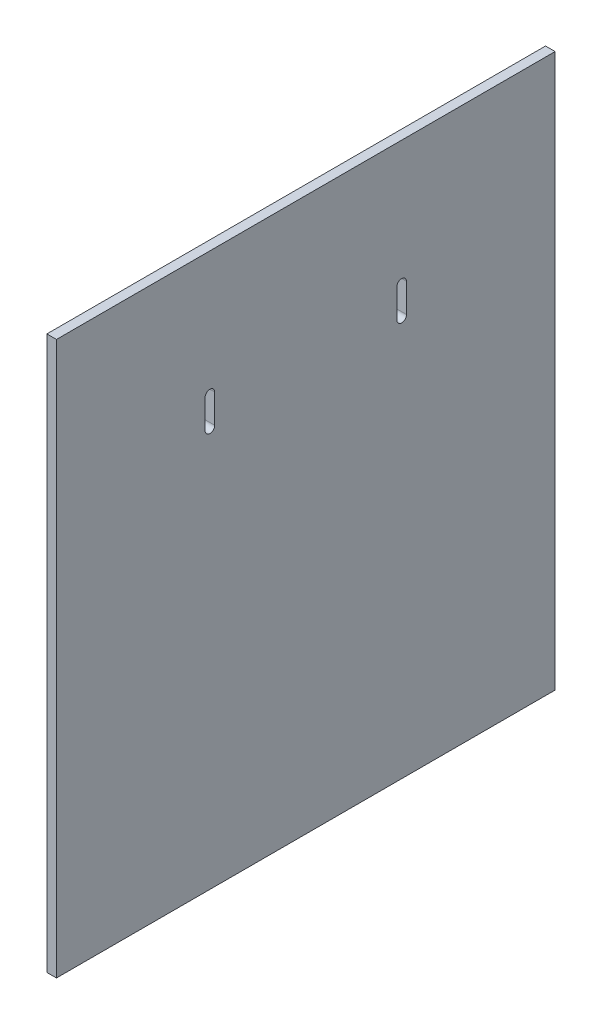
ISO-10303-21;
HEADER;
FILE_DESCRIPTION(('STEP AP214'),'2;1');
FILE_NAME('part.step','',(''),(''),'','','');
FILE_SCHEMA(('AUTOMOTIVE_DESIGN { 1 0 10303 214 1 1 1 1 }'));
ENDSEC;
DATA;
#1=APPLICATION_CONTEXT('core data for automotive mechanical design processes');
#2=APPLICATION_PROTOCOL_DEFINITION('international standard','automotive_design',2000,#1);
#3=PRODUCT_CONTEXT('',#1,'mechanical');
#4=PRODUCT('Part','Part','',(#3));
#5=PRODUCT_RELATED_PRODUCT_CATEGORY('part','',(#4));
#6=PRODUCT_DEFINITION_FORMATION('','',#4);
#7=PRODUCT_DEFINITION_CONTEXT('part definition',#1,'design');
#8=PRODUCT_DEFINITION('design','',#6,#7);
#9=PRODUCT_DEFINITION_SHAPE('','',#8);
#10=(LENGTH_UNIT() NAMED_UNIT(*) SI_UNIT(.MILLI.,.METRE.));
#11=(NAMED_UNIT(*) PLANE_ANGLE_UNIT() SI_UNIT($,.RADIAN.));
#12=(NAMED_UNIT(*) SI_UNIT($,.STERADIAN.) SOLID_ANGLE_UNIT());
#13=UNCERTAINTY_MEASURE_WITH_UNIT(LENGTH_MEASURE(1.E-05),#10,'distance_accuracy_value','');
#14=(GEOMETRIC_REPRESENTATION_CONTEXT(3) GLOBAL_UNCERTAINTY_ASSIGNED_CONTEXT((#13)) GLOBAL_UNIT_ASSIGNED_CONTEXT((#10,
#11,#12)) REPRESENTATION_CONTEXT('',''));
#15=CARTESIAN_POINT('',(0.,0.,0.));
#16=DIRECTION('',(0.,0.,1.));
#17=DIRECTION('',(1.,0.,0.));
#18=AXIS2_PLACEMENT_3D('',#15,#16,#17);
#19=CARTESIAN_POINT('',(3.,0.,0.));
#20=DIRECTION('',(0.,0.,-1.));
#21=DIRECTION('',(-1.,0.,0.));
#22=AXIS2_PLACEMENT_3D('',#19,#20,#21);
#23=PLANE('',#22);
#24=DIRECTION('',(0.,-1.,0.));
#25=VECTOR('',#24,1.);
#26=CARTESIAN_POINT('',(0.,0.,0.));
#27=LINE('',#26,#25);
#28=CARTESIAN_POINT('',(0.,173.,0.));
#29=VERTEX_POINT('',#28);
#30=CARTESIAN_POINT('',(0.,0.,0.));
#31=VERTEX_POINT('',#30);
#32=EDGE_CURVE('E158',#29,#31,#27,.T.);
#33=ORIENTED_EDGE('',*,*,#32,.T.);
#34=DIRECTION('',(-1.,0.,0.));
#35=VECTOR('',#34,1.);
#36=CARTESIAN_POINT('',(3.,0.,0.));
#37=LINE('',#36,#35);
#38=CARTESIAN_POINT('',(3.,0.,0.));
#39=VERTEX_POINT('',#38);
#40=EDGE_CURVE('E11',#39,#31,#37,.T.);
#41=ORIENTED_EDGE('',*,*,#40,.F.);
#42=DIRECTION('',(0.,-1.,0.));
#43=VECTOR('',#42,1.);
#44=CARTESIAN_POINT('',(3.,0.,0.));
#45=LINE('',#44,#43);
#46=CARTESIAN_POINT('',(3.,173.,0.));
#47=VERTEX_POINT('',#46);
#48=EDGE_CURVE('E191',#47,#39,#45,.T.);
#49=ORIENTED_EDGE('',*,*,#48,.F.);
#50=DIRECTION('',(-1.,0.,0.));
#51=VECTOR('',#50,1.);
#52=CARTESIAN_POINT('',(3.,173.,0.));
#53=LINE('',#52,#51);
#54=EDGE_CURVE('E201',#47,#29,#53,.T.);
#55=ORIENTED_EDGE('',*,*,#54,.T.);
#56=EDGE_LOOP('',(#33,#41,#49,#55));
#57=FACE_BOUND('',#56,.T.);
#58=ADVANCED_FACE('F33',(#57),#23,.F.);
#59=CARTESIAN_POINT('',(3.,0.,0.));
#60=DIRECTION('',(0.,1.,0.));
#61=DIRECTION('',(0.,0.,1.));
#62=AXIS2_PLACEMENT_3D('',#59,#60,#61);
#63=PLANE('',#62);
#64=DIRECTION('',(0.,0.,-1.));
#65=VECTOR('',#64,1.);
#66=CARTESIAN_POINT('',(0.,0.,0.));
#67=LINE('',#66,#65);
#68=CARTESIAN_POINT('',(0.,0.,-156.));
#69=VERTEX_POINT('',#68);
#70=EDGE_CURVE('E204',#31,#69,#67,.T.);
#71=ORIENTED_EDGE('',*,*,#70,.T.);
#72=DIRECTION('',(-1.,0.,0.));
#73=VECTOR('',#72,1.);
#74=CARTESIAN_POINT('',(3.,0.,-156.));
#75=LINE('',#74,#73);
#76=CARTESIAN_POINT('',(3.,0.,-156.));
#77=VERTEX_POINT('',#76);
#78=EDGE_CURVE('E40',#77,#69,#75,.T.);
#79=ORIENTED_EDGE('',*,*,#78,.F.);
#80=DIRECTION('',(0.,0.,-1.));
#81=VECTOR('',#80,1.);
#82=CARTESIAN_POINT('',(3.,0.,0.));
#83=LINE('',#82,#81);
#84=EDGE_CURVE('E194',#39,#77,#83,.T.);
#85=ORIENTED_EDGE('',*,*,#84,.F.);
#86=ORIENTED_EDGE('',*,*,#40,.T.);
#87=EDGE_LOOP('',(#71,#79,#85,#86));
#88=FACE_BOUND('',#87,.T.);
#89=ADVANCED_FACE('F233',(#88),#63,.F.);
#90=CARTESIAN_POINT('',(3.,0.,-156.));
#91=DIRECTION('',(0.,0.,1.));
#92=DIRECTION('',(1.,0.,0.));
#93=AXIS2_PLACEMENT_3D('',#90,#91,#92);
#94=PLANE('',#93);
#95=DIRECTION('',(0.,1.,0.));
#96=VECTOR('',#95,1.);
#97=CARTESIAN_POINT('',(0.,0.,-156.));
#98=LINE('',#97,#96);
#99=CARTESIAN_POINT('',(0.,173.,-156.));
#100=VERTEX_POINT('',#99);
#101=EDGE_CURVE('E206',#69,#100,#98,.T.);
#102=ORIENTED_EDGE('',*,*,#101,.T.);
#103=DIRECTION('',(-1.,0.,0.));
#104=VECTOR('',#103,1.);
#105=CARTESIAN_POINT('',(3.,173.,-156.));
#106=LINE('',#105,#104);
#107=CARTESIAN_POINT('',(3.,173.,-156.));
#108=VERTEX_POINT('',#107);
#109=EDGE_CURVE('E211',#108,#100,#106,.T.);
#110=ORIENTED_EDGE('',*,*,#109,.F.);
#111=DIRECTION('',(0.,1.,0.));
#112=VECTOR('',#111,1.);
#113=CARTESIAN_POINT('',(3.,0.,-156.));
#114=LINE('',#113,#112);
#115=EDGE_CURVE('E197',#77,#108,#114,.T.);
#116=ORIENTED_EDGE('',*,*,#115,.F.);
#117=ORIENTED_EDGE('',*,*,#78,.T.);
#118=EDGE_LOOP('',(#102,#110,#116,#117));
#119=FACE_BOUND('',#118,.T.);
#120=ADVANCED_FACE('F218',(#119),#94,.F.);
#121=CARTESIAN_POINT('',(3.,173.,0.));
#122=DIRECTION('',(0.,-1.,0.));
#123=DIRECTION('',(0.,0.,-1.));
#124=AXIS2_PLACEMENT_3D('',#121,#122,#123);
#125=PLANE('',#124);
#126=DIRECTION('',(0.,0.,1.));
#127=VECTOR('',#126,1.);
#128=CARTESIAN_POINT('',(0.,173.,0.));
#129=LINE('',#128,#127);
#130=EDGE_CURVE('E195',#100,#29,#129,.T.);
#131=ORIENTED_EDGE('',*,*,#130,.T.);
#132=ORIENTED_EDGE('',*,*,#54,.F.);
#133=DIRECTION('',(0.,0.,1.));
#134=VECTOR('',#133,1.);
#135=CARTESIAN_POINT('',(3.,173.,0.));
#136=LINE('',#135,#134);
#137=EDGE_CURVE('E199',#108,#47,#136,.T.);
#138=ORIENTED_EDGE('',*,*,#137,.F.);
#139=ORIENTED_EDGE('',*,*,#109,.T.);
#140=EDGE_LOOP('',(#131,#132,#138,#139));
#141=FACE_BOUND('',#140,.T.);
#142=ADVANCED_FACE('F226',(#141),#125,.F.);
#143=CARTESIAN_POINT('',(3.,0.,0.));
#144=DIRECTION('',(-1.,0.,0.));
#145=DIRECTION('',(0.,0.,1.));
#146=AXIS2_PLACEMENT_3D('',#143,#144,#145);
#147=PLANE('',#146);
#148=DIRECTION('',(0.,1.,0.));
#149=VECTOR('',#148,1.);
#150=CARTESIAN_POINT('',(3.,125.,-49.5));
#151=LINE('',#150,#149);
#152=CARTESIAN_POINT('',(3.,125.,-49.5));
#153=VERTEX_POINT('',#152);
#154=CARTESIAN_POINT('',(3.,134.,-49.5));
#155=VERTEX_POINT('',#154);
#156=EDGE_CURVE('E151',#153,#155,#151,.T.);
#157=ORIENTED_EDGE('',*,*,#156,.F.);
#158=CARTESIAN_POINT('',(3.,125.,-48.));
#159=DIRECTION('',(1.,0.,0.));
#160=DIRECTION('',(0.,0.,-1.));
#161=AXIS2_PLACEMENT_3D('',#158,#159,#160);
#162=CIRCLE('',#161,1.5);
#163=CARTESIAN_POINT('',(3.,125.,-46.5));
#164=VERTEX_POINT('',#163);
#165=EDGE_CURVE('E47',#164,#153,#162,.T.);
#166=ORIENTED_EDGE('',*,*,#165,.F.);
#167=DIRECTION('',(0.,-1.,0.));
#168=VECTOR('',#167,1.);
#169=CARTESIAN_POINT('',(3.,125.,-46.5));
#170=LINE('',#169,#168);
#171=CARTESIAN_POINT('',(3.,134.,-46.5));
#172=VERTEX_POINT('',#171);
#173=EDGE_CURVE('E142',#172,#164,#170,.T.);
#174=ORIENTED_EDGE('',*,*,#173,.F.);
#175=CARTESIAN_POINT('',(3.,134.,-48.));
#176=DIRECTION('',(1.,0.,0.));
#177=DIRECTION('',(0.,0.,-1.));
#178=AXIS2_PLACEMENT_3D('',#175,#176,#177);
#179=CIRCLE('',#178,1.5);
#180=EDGE_CURVE('E145',#155,#172,#179,.T.);
#181=ORIENTED_EDGE('',*,*,#180,.F.);
#182=EDGE_LOOP('',(#157,#166,#174,#181));
#183=FACE_BOUND('',#182,.T.);
#184=DIRECTION('',(0.,1.,0.));
#185=VECTOR('',#184,1.);
#186=CARTESIAN_POINT('',(3.,125.,-109.5));
#187=LINE('',#186,#185);
#188=CARTESIAN_POINT('',(3.,125.,-109.5));
#189=VERTEX_POINT('',#188);
#190=CARTESIAN_POINT('',(3.,134.,-109.5));
#191=VERTEX_POINT('',#190);
#192=EDGE_CURVE('E177',#189,#191,#187,.T.);
#193=ORIENTED_EDGE('',*,*,#192,.F.);
#194=CARTESIAN_POINT('',(3.,125.,-108.));
#195=DIRECTION('',(1.,0.,0.));
#196=DIRECTION('',(0.,0.,1.));
#197=AXIS2_PLACEMENT_3D('',#194,#195,#196);
#198=CIRCLE('',#197,1.5);
#199=CARTESIAN_POINT('',(3.,125.,-106.5));
#200=VERTEX_POINT('',#199);
#201=EDGE_CURVE('E55',#200,#189,#198,.T.);
#202=ORIENTED_EDGE('',*,*,#201,.F.);
#203=DIRECTION('',(0.,-1.,0.));
#204=VECTOR('',#203,1.);
#205=CARTESIAN_POINT('',(3.,125.,-106.5));
#206=LINE('',#205,#204);
#207=CARTESIAN_POINT('',(3.,134.,-106.5));
#208=VERTEX_POINT('',#207);
#209=EDGE_CURVE('E166',#208,#200,#206,.T.);
#210=ORIENTED_EDGE('',*,*,#209,.F.);
#211=CARTESIAN_POINT('',(3.,134.,-108.));
#212=DIRECTION('',(1.,0.,0.));
#213=DIRECTION('',(0.,0.,1.));
#214=AXIS2_PLACEMENT_3D('',#211,#212,#213);
#215=CIRCLE('',#214,1.5);
#216=EDGE_CURVE('E180',#191,#208,#215,.T.);
#217=ORIENTED_EDGE('',*,*,#216,.F.);
#218=EDGE_LOOP('',(#193,#202,#210,#217));
#219=FACE_BOUND('',#218,.T.);
#220=ORIENTED_EDGE('',*,*,#48,.T.);
#221=ORIENTED_EDGE('',*,*,#84,.T.);
#222=ORIENTED_EDGE('',*,*,#115,.T.);
#223=ORIENTED_EDGE('',*,*,#137,.T.);
#224=EDGE_LOOP('',(#220,#221,#222,#223));
#225=FACE_BOUND('',#224,.T.);
#226=ADVANCED_FACE('F232',(#183,#219,#225),#147,.F.);
#227=CARTESIAN_POINT('',(0.,0.,0.));
#228=DIRECTION('',(-1.,0.,0.));
#229=DIRECTION('',(0.,0.,1.));
#230=AXIS2_PLACEMENT_3D('',#227,#228,#229);
#231=PLANE('',#230);
#232=CARTESIAN_POINT('',(0.,125.,-48.));
#233=DIRECTION('',(1.,0.,0.));
#234=DIRECTION('',(0.,0.,-1.));
#235=AXIS2_PLACEMENT_3D('',#232,#233,#234);
#236=CIRCLE('',#235,1.5);
#237=CARTESIAN_POINT('',(0.,125.,-46.5));
#238=VERTEX_POINT('',#237);
#239=CARTESIAN_POINT('',(0.,125.,-49.5));
#240=VERTEX_POINT('',#239);
#241=EDGE_CURVE('E123',#238,#240,#236,.T.);
#242=ORIENTED_EDGE('',*,*,#241,.T.);
#243=DIRECTION('',(0.,1.,0.));
#244=VECTOR('',#243,1.);
#245=CARTESIAN_POINT('',(0.,125.,-49.5));
#246=LINE('',#245,#244);
#247=CARTESIAN_POINT('',(0.,134.,-49.5));
#248=VERTEX_POINT('',#247);
#249=EDGE_CURVE('E133',#240,#248,#246,.T.);
#250=ORIENTED_EDGE('',*,*,#249,.T.);
#251=CARTESIAN_POINT('',(0.,134.,-48.));
#252=DIRECTION('',(1.,0.,0.));
#253=DIRECTION('',(0.,0.,-1.));
#254=AXIS2_PLACEMENT_3D('',#251,#252,#253);
#255=CIRCLE('',#254,1.5);
#256=CARTESIAN_POINT('',(0.,134.,-46.5));
#257=VERTEX_POINT('',#256);
#258=EDGE_CURVE('E137',#248,#257,#255,.T.);
#259=ORIENTED_EDGE('',*,*,#258,.T.);
#260=DIRECTION('',(0.,-1.,0.));
#261=VECTOR('',#260,1.);
#262=CARTESIAN_POINT('',(0.,125.,-46.5));
#263=LINE('',#262,#261);
#264=EDGE_CURVE('E129',#257,#238,#263,.T.);
#265=ORIENTED_EDGE('',*,*,#264,.T.);
#266=EDGE_LOOP('',(#242,#250,#259,#265));
#267=FACE_BOUND('',#266,.T.);
#268=CARTESIAN_POINT('',(0.,125.,-108.));
#269=DIRECTION('',(1.,0.,0.));
#270=DIRECTION('',(0.,0.,1.));
#271=AXIS2_PLACEMENT_3D('',#268,#269,#270);
#272=CIRCLE('',#271,1.5);
#273=CARTESIAN_POINT('',(0.,125.,-106.5));
#274=VERTEX_POINT('',#273);
#275=CARTESIAN_POINT('',(0.,125.,-109.5));
#276=VERTEX_POINT('',#275);
#277=EDGE_CURVE('E162',#274,#276,#272,.T.);
#278=ORIENTED_EDGE('',*,*,#277,.T.);
#279=DIRECTION('',(0.,1.,0.));
#280=VECTOR('',#279,1.);
#281=CARTESIAN_POINT('',(0.,125.,-109.5));
#282=LINE('',#281,#280);
#283=CARTESIAN_POINT('',(0.,134.,-109.5));
#284=VERTEX_POINT('',#283);
#285=EDGE_CURVE('E165',#276,#284,#282,.T.);
#286=ORIENTED_EDGE('',*,*,#285,.T.);
#287=CARTESIAN_POINT('',(0.,134.,-108.));
#288=DIRECTION('',(1.,0.,0.));
#289=DIRECTION('',(0.,0.,1.));
#290=AXIS2_PLACEMENT_3D('',#287,#288,#289);
#291=CIRCLE('',#290,1.5);
#292=CARTESIAN_POINT('',(0.,134.,-106.5));
#293=VERTEX_POINT('',#292);
#294=EDGE_CURVE('E169',#284,#293,#291,.T.);
#295=ORIENTED_EDGE('',*,*,#294,.T.);
#296=DIRECTION('',(0.,-1.,0.));
#297=VECTOR('',#296,1.);
#298=CARTESIAN_POINT('',(0.,125.,-106.5));
#299=LINE('',#298,#297);
#300=EDGE_CURVE('E172',#293,#274,#299,.T.);
#301=ORIENTED_EDGE('',*,*,#300,.T.);
#302=EDGE_LOOP('',(#278,#286,#295,#301));
#303=FACE_BOUND('',#302,.T.);
#304=ORIENTED_EDGE('',*,*,#32,.F.);
#305=ORIENTED_EDGE('',*,*,#130,.F.);
#306=ORIENTED_EDGE('',*,*,#101,.F.);
#307=ORIENTED_EDGE('',*,*,#70,.F.);
#308=EDGE_LOOP('',(#304,#305,#306,#307));
#309=FACE_BOUND('',#308,.T.);
#310=ADVANCED_FACE('F139',(#267,#303,#309),#231,.T.);
#311=CARTESIAN_POINT('',(0.,125.,-108.));
#312=DIRECTION('',(1.,0.,0.));
#313=DIRECTION('',(0.,0.,-1.));
#314=AXIS2_PLACEMENT_3D('',#311,#312,#313);
#315=CYLINDRICAL_SURFACE('',#314,1.5);
#316=ORIENTED_EDGE('',*,*,#201,.T.);
#317=DIRECTION('',(1.,0.,0.));
#318=VECTOR('',#317,1.);
#319=CARTESIAN_POINT('',(0.,125.,-109.5));
#320=LINE('',#319,#318);
#321=EDGE_CURVE('E175',#276,#189,#320,.T.);
#322=ORIENTED_EDGE('',*,*,#321,.F.);
#323=ORIENTED_EDGE('',*,*,#277,.F.);
#324=DIRECTION('',(1.,0.,0.));
#325=VECTOR('',#324,1.);
#326=CARTESIAN_POINT('',(0.,125.,-106.5));
#327=LINE('',#326,#325);
#328=EDGE_CURVE('E152',#274,#200,#327,.T.);
#329=ORIENTED_EDGE('',*,*,#328,.T.);
#330=EDGE_LOOP('',(#316,#322,#323,#329));
#331=FACE_BOUND('',#330,.T.);
#332=ADVANCED_FACE('F245',(#331),#315,.F.);
#333=CARTESIAN_POINT('',(0.,125.,-106.5));
#334=DIRECTION('',(0.,0.,1.));
#335=DIRECTION('',(1.,0.,0.));
#336=AXIS2_PLACEMENT_3D('',#333,#334,#335);
#337=PLANE('',#336);
#338=ORIENTED_EDGE('',*,*,#209,.T.);
#339=ORIENTED_EDGE('',*,*,#328,.F.);
#340=ORIENTED_EDGE('',*,*,#300,.F.);
#341=DIRECTION('',(1.,0.,0.));
#342=VECTOR('',#341,1.);
#343=CARTESIAN_POINT('',(0.,134.,-106.5));
#344=LINE('',#343,#342);
#345=EDGE_CURVE('E186',#293,#208,#344,.T.);
#346=ORIENTED_EDGE('',*,*,#345,.T.);
#347=EDGE_LOOP('',(#338,#339,#340,#346));
#348=FACE_BOUND('',#347,.T.);
#349=ADVANCED_FACE('F251',(#348),#337,.F.);
#350=CARTESIAN_POINT('',(0.,134.,-108.));
#351=DIRECTION('',(1.,0.,0.));
#352=DIRECTION('',(0.,0.,-1.));
#353=AXIS2_PLACEMENT_3D('',#350,#351,#352);
#354=CYLINDRICAL_SURFACE('',#353,1.5);
#355=ORIENTED_EDGE('',*,*,#216,.T.);
#356=ORIENTED_EDGE('',*,*,#345,.F.);
#357=ORIENTED_EDGE('',*,*,#294,.F.);
#358=DIRECTION('',(1.,0.,0.));
#359=VECTOR('',#358,1.);
#360=CARTESIAN_POINT('',(0.,134.,-109.5));
#361=LINE('',#360,#359);
#362=EDGE_CURVE('E188',#284,#191,#361,.T.);
#363=ORIENTED_EDGE('',*,*,#362,.T.);
#364=EDGE_LOOP('',(#355,#356,#357,#363));
#365=FACE_BOUND('',#364,.T.);
#366=ADVANCED_FACE('F255',(#365),#354,.F.);
#367=CARTESIAN_POINT('',(0.,125.,-109.5));
#368=DIRECTION('',(0.,0.,-1.));
#369=DIRECTION('',(-1.,0.,0.));
#370=AXIS2_PLACEMENT_3D('',#367,#368,#369);
#371=PLANE('',#370);
#372=ORIENTED_EDGE('',*,*,#192,.T.);
#373=ORIENTED_EDGE('',*,*,#362,.F.);
#374=ORIENTED_EDGE('',*,*,#285,.F.);
#375=ORIENTED_EDGE('',*,*,#321,.T.);
#376=EDGE_LOOP('',(#372,#373,#374,#375));
#377=FACE_BOUND('',#376,.T.);
#378=ADVANCED_FACE('F252',(#377),#371,.F.);
#379=CARTESIAN_POINT('',(0.,125.,-48.));
#380=DIRECTION('',(1.,0.,0.));
#381=DIRECTION('',(0.,0.,-1.));
#382=AXIS2_PLACEMENT_3D('',#379,#380,#381);
#383=CYLINDRICAL_SURFACE('',#382,1.5);
#384=ORIENTED_EDGE('',*,*,#165,.T.);
#385=DIRECTION('',(1.,0.,0.));
#386=VECTOR('',#385,1.);
#387=CARTESIAN_POINT('',(0.,125.,-49.5));
#388=LINE('',#387,#386);
#389=EDGE_CURVE('E119',#240,#153,#388,.T.);
#390=ORIENTED_EDGE('',*,*,#389,.F.);
#391=ORIENTED_EDGE('',*,*,#241,.F.);
#392=DIRECTION('',(1.,0.,0.));
#393=VECTOR('',#392,1.);
#394=CARTESIAN_POINT('',(0.,125.,-46.5));
#395=LINE('',#394,#393);
#396=EDGE_CURVE('E156',#238,#164,#395,.T.);
#397=ORIENTED_EDGE('',*,*,#396,.T.);
#398=EDGE_LOOP('',(#384,#390,#391,#397));
#399=FACE_BOUND('',#398,.T.);
#400=ADVANCED_FACE('F121',(#399),#383,.F.);
#401=CARTESIAN_POINT('',(0.,125.,-46.5));
#402=DIRECTION('',(0.,0.,1.));
#403=DIRECTION('',(1.,0.,0.));
#404=AXIS2_PLACEMENT_3D('',#401,#402,#403);
#405=PLANE('',#404);
#406=ORIENTED_EDGE('',*,*,#173,.T.);
#407=ORIENTED_EDGE('',*,*,#396,.F.);
#408=ORIENTED_EDGE('',*,*,#264,.F.);
#409=DIRECTION('',(1.,0.,0.));
#410=VECTOR('',#409,1.);
#411=CARTESIAN_POINT('',(0.,134.,-46.5));
#412=LINE('',#411,#410);
#413=EDGE_CURVE('E159',#257,#172,#412,.T.);
#414=ORIENTED_EDGE('',*,*,#413,.T.);
#415=EDGE_LOOP('',(#406,#407,#408,#414));
#416=FACE_BOUND('',#415,.T.);
#417=ADVANCED_FACE('F265',(#416),#405,.F.);
#418=CARTESIAN_POINT('',(0.,134.,-48.));
#419=DIRECTION('',(1.,0.,0.));
#420=DIRECTION('',(0.,0.,-1.));
#421=AXIS2_PLACEMENT_3D('',#418,#419,#420);
#422=CYLINDRICAL_SURFACE('',#421,1.5);
#423=ORIENTED_EDGE('',*,*,#180,.T.);
#424=ORIENTED_EDGE('',*,*,#413,.F.);
#425=ORIENTED_EDGE('',*,*,#258,.F.);
#426=DIRECTION('',(1.,0.,0.));
#427=VECTOR('',#426,1.);
#428=CARTESIAN_POINT('',(0.,134.,-49.5));
#429=LINE('',#428,#427);
#430=EDGE_CURVE('E128',#248,#155,#429,.T.);
#431=ORIENTED_EDGE('',*,*,#430,.T.);
#432=EDGE_LOOP('',(#423,#424,#425,#431));
#433=FACE_BOUND('',#432,.T.);
#434=ADVANCED_FACE('F268',(#433),#422,.F.);
#435=CARTESIAN_POINT('',(0.,125.,-49.5));
#436=DIRECTION('',(0.,0.,-1.));
#437=DIRECTION('',(-1.,0.,0.));
#438=AXIS2_PLACEMENT_3D('',#435,#436,#437);
#439=PLANE('',#438);
#440=ORIENTED_EDGE('',*,*,#156,.T.);
#441=ORIENTED_EDGE('',*,*,#430,.F.);
#442=ORIENTED_EDGE('',*,*,#249,.F.);
#443=ORIENTED_EDGE('',*,*,#389,.T.);
#444=EDGE_LOOP('',(#440,#441,#442,#443));
#445=FACE_BOUND('',#444,.T.);
#446=ADVANCED_FACE('F134',(#445),#439,.F.);
#447=CLOSED_SHELL('',(#58,#89,#120,#142,#226,#310,#332,#349,#366,#378,#400,#417,#434,#446));
#448=MANIFOLD_SOLID_BREP('B2',#447);
#449=ADVANCED_BREP_SHAPE_REPRESENTATION('',(#18,#448),#14);
#450=SHAPE_DEFINITION_REPRESENTATION(#9,#449);
ENDSEC;
END-ISO-10303-21;
